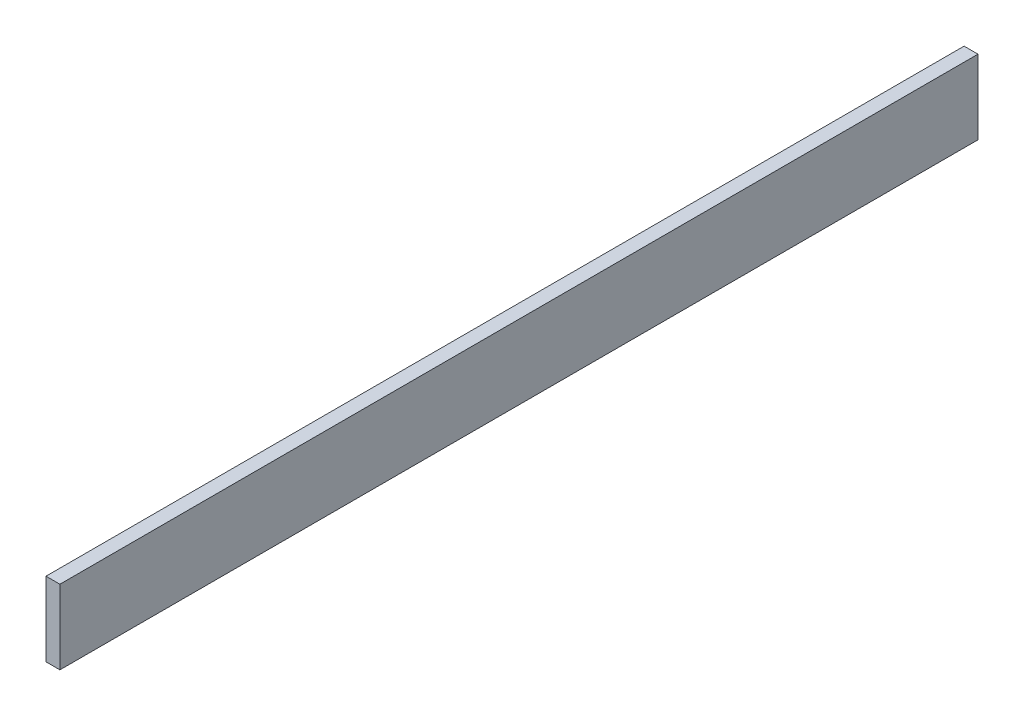
ISO-10303-21;
HEADER;
FILE_DESCRIPTION(('STEP AP214'),'2;1');
FILE_NAME('part.step','',(''),(''),'','','');
FILE_SCHEMA(('AUTOMOTIVE_DESIGN { 1 0 10303 214 1 1 1 1 }'));
ENDSEC;
DATA;
#1=APPLICATION_CONTEXT('core data for automotive mechanical design processes');
#2=APPLICATION_PROTOCOL_DEFINITION('international standard','automotive_design',2000,#1);
#3=PRODUCT_CONTEXT('',#1,'mechanical');
#4=PRODUCT('Part','Part','',(#3));
#5=PRODUCT_RELATED_PRODUCT_CATEGORY('part','',(#4));
#6=PRODUCT_DEFINITION_FORMATION('','',#4);
#7=PRODUCT_DEFINITION_CONTEXT('part definition',#1,'design');
#8=PRODUCT_DEFINITION('design','',#6,#7);
#9=PRODUCT_DEFINITION_SHAPE('','',#8);
#10=(LENGTH_UNIT() NAMED_UNIT(*) SI_UNIT(.MILLI.,.METRE.));
#11=(NAMED_UNIT(*) PLANE_ANGLE_UNIT() SI_UNIT($,.RADIAN.));
#12=(NAMED_UNIT(*) SI_UNIT($,.STERADIAN.) SOLID_ANGLE_UNIT());
#13=UNCERTAINTY_MEASURE_WITH_UNIT(LENGTH_MEASURE(1.E-05),#10,'distance_accuracy_value','');
#14=(GEOMETRIC_REPRESENTATION_CONTEXT(3) GLOBAL_UNCERTAINTY_ASSIGNED_CONTEXT((#13)) GLOBAL_UNIT_ASSIGNED_CONTEXT((#10,
#11,#12)) REPRESENTATION_CONTEXT('',''));
#15=CARTESIAN_POINT('',(0.,0.,0.));
#16=DIRECTION('',(0.,0.,1.));
#17=DIRECTION('',(1.,0.,0.));
#18=AXIS2_PLACEMENT_3D('',#15,#16,#17);
#19=CARTESIAN_POINT('',(19.05,-50.8000000000001,-628.65));
#20=DIRECTION('',(0.,0.,1.));
#21=DIRECTION('',(1.,0.,0.));
#22=AXIS2_PLACEMENT_3D('',#19,#20,#21);
#23=PLANE('',#22);
#24=DIRECTION('',(0.,1.,0.));
#25=VECTOR('',#24,1.);
#26=CARTESIAN_POINT('',(0.,-50.8000000000001,-628.65));
#27=LINE('',#26,#25);
#28=CARTESIAN_POINT('',(0.,-50.8000000000001,-628.65));
#29=VERTEX_POINT('',#28);
#30=CARTESIAN_POINT('',(0.,50.8,-628.65));
#31=VERTEX_POINT('',#30);
#32=EDGE_CURVE('E96',#29,#31,#27,.T.);
#33=ORIENTED_EDGE('',*,*,#32,.T.);
#34=DIRECTION('',(-1.,0.,0.));
#35=VECTOR('',#34,1.);
#36=CARTESIAN_POINT('',(19.05,50.8,-628.65));
#37=LINE('',#36,#35);
#38=CARTESIAN_POINT('',(19.05,50.8,-628.65));
#39=VERTEX_POINT('',#38);
#40=EDGE_CURVE('E11',#39,#31,#37,.T.);
#41=ORIENTED_EDGE('',*,*,#40,.F.);
#42=DIRECTION('',(0.,1.,0.));
#43=VECTOR('',#42,1.);
#44=CARTESIAN_POINT('',(19.05,-50.8000000000001,-628.65));
#45=LINE('',#44,#43);
#46=CARTESIAN_POINT('',(19.05,-50.8000000000001,-628.65));
#47=VERTEX_POINT('',#46);
#48=EDGE_CURVE('E84',#47,#39,#45,.T.);
#49=ORIENTED_EDGE('',*,*,#48,.F.);
#50=DIRECTION('',(-1.,0.,0.));
#51=VECTOR('',#50,1.);
#52=CARTESIAN_POINT('',(19.05,-50.8000000000001,-628.65));
#53=LINE('',#52,#51);
#54=EDGE_CURVE('E92',#47,#29,#53,.T.);
#55=ORIENTED_EDGE('',*,*,#54,.T.);
#56=EDGE_LOOP('',(#33,#41,#49,#55));
#57=FACE_BOUND('',#56,.T.);
#58=ADVANCED_FACE('F33',(#57),#23,.F.);
#59=CARTESIAN_POINT('',(19.05,50.8,628.65));
#60=DIRECTION('',(0.,-1.,0.));
#61=DIRECTION('',(0.,0.,-1.));
#62=AXIS2_PLACEMENT_3D('',#59,#60,#61);
#63=PLANE('',#62);
#64=DIRECTION('',(0.,0.,1.));
#65=VECTOR('',#64,1.);
#66=CARTESIAN_POINT('',(0.,50.8,628.65));
#67=LINE('',#66,#65);
#68=CARTESIAN_POINT('',(0.,50.8,628.65));
#69=VERTEX_POINT('',#68);
#70=EDGE_CURVE('E88',#31,#69,#67,.T.);
#71=ORIENTED_EDGE('',*,*,#70,.T.);
#72=DIRECTION('',(-1.,0.,0.));
#73=VECTOR('',#72,1.);
#74=CARTESIAN_POINT('',(19.05,50.8,628.65));
#75=LINE('',#74,#73);
#76=CARTESIAN_POINT('',(19.05,50.8,628.65));
#77=VERTEX_POINT('',#76);
#78=EDGE_CURVE('E41',#77,#69,#75,.T.);
#79=ORIENTED_EDGE('',*,*,#78,.F.);
#80=DIRECTION('',(0.,0.,1.));
#81=VECTOR('',#80,1.);
#82=CARTESIAN_POINT('',(19.05,50.8,628.65));
#83=LINE('',#82,#81);
#84=EDGE_CURVE('E79',#39,#77,#83,.T.);
#85=ORIENTED_EDGE('',*,*,#84,.F.);
#86=ORIENTED_EDGE('',*,*,#40,.T.);
#87=EDGE_LOOP('',(#71,#79,#85,#86));
#88=FACE_BOUND('',#87,.T.);
#89=ADVANCED_FACE('F87',(#88),#63,.F.);
#90=CARTESIAN_POINT('',(19.05,-50.8000000000001,628.65));
#91=DIRECTION('',(0.,0.,-1.));
#92=DIRECTION('',(-1.,0.,0.));
#93=AXIS2_PLACEMENT_3D('',#90,#91,#92);
#94=PLANE('',#93);
#95=DIRECTION('',(0.,-1.,0.));
#96=VECTOR('',#95,1.);
#97=CARTESIAN_POINT('',(0.,-50.8000000000001,628.65));
#98=LINE('',#97,#96);
#99=CARTESIAN_POINT('',(0.,-50.8000000000001,628.65));
#100=VERTEX_POINT('',#99);
#101=EDGE_CURVE('E66',#69,#100,#98,.T.);
#102=ORIENTED_EDGE('',*,*,#101,.T.);
#103=DIRECTION('',(-1.,0.,0.));
#104=VECTOR('',#103,1.);
#105=CARTESIAN_POINT('',(19.05,-50.8000000000001,628.65));
#106=LINE('',#105,#104);
#107=CARTESIAN_POINT('',(19.05,-50.8000000000001,628.65));
#108=VERTEX_POINT('',#107);
#109=EDGE_CURVE('E89',#108,#100,#106,.T.);
#110=ORIENTED_EDGE('',*,*,#109,.F.);
#111=DIRECTION('',(0.,-1.,0.));
#112=VECTOR('',#111,1.);
#113=CARTESIAN_POINT('',(19.05,-50.8000000000001,628.65));
#114=LINE('',#113,#112);
#115=EDGE_CURVE('E82',#77,#108,#114,.T.);
#116=ORIENTED_EDGE('',*,*,#115,.F.);
#117=ORIENTED_EDGE('',*,*,#78,.T.);
#118=EDGE_LOOP('',(#102,#110,#116,#117));
#119=FACE_BOUND('',#118,.T.);
#120=ADVANCED_FACE('F90',(#119),#94,.F.);
#121=CARTESIAN_POINT('',(19.05,-50.8000000000001,628.65));
#122=DIRECTION('',(0.,1.,0.));
#123=DIRECTION('',(0.,0.,1.));
#124=AXIS2_PLACEMENT_3D('',#121,#122,#123);
#125=PLANE('',#124);
#126=DIRECTION('',(0.,0.,-1.));
#127=VECTOR('',#126,1.);
#128=CARTESIAN_POINT('',(0.,-50.8000000000001,628.65));
#129=LINE('',#128,#127);
#130=EDGE_CURVE('E72',#100,#29,#129,.T.);
#131=ORIENTED_EDGE('',*,*,#130,.T.);
#132=ORIENTED_EDGE('',*,*,#54,.F.);
#133=DIRECTION('',(0.,0.,-1.));
#134=VECTOR('',#133,1.);
#135=CARTESIAN_POINT('',(19.05,-50.8000000000001,628.65));
#136=LINE('',#135,#134);
#137=EDGE_CURVE('E49',#108,#47,#136,.T.);
#138=ORIENTED_EDGE('',*,*,#137,.F.);
#139=ORIENTED_EDGE('',*,*,#109,.T.);
#140=EDGE_LOOP('',(#131,#132,#138,#139));
#141=FACE_BOUND('',#140,.T.);
#142=ADVANCED_FACE('F103',(#141),#125,.F.);
#143=CARTESIAN_POINT('',(19.05,0.,0.));
#144=DIRECTION('',(-1.,0.,0.));
#145=DIRECTION('',(0.,0.,1.));
#146=AXIS2_PLACEMENT_3D('',#143,#144,#145);
#147=PLANE('',#146);
#148=ORIENTED_EDGE('',*,*,#48,.T.);
#149=ORIENTED_EDGE('',*,*,#84,.T.);
#150=ORIENTED_EDGE('',*,*,#115,.T.);
#151=ORIENTED_EDGE('',*,*,#137,.T.);
#152=EDGE_LOOP('',(#148,#149,#150,#151));
#153=FACE_BOUND('',#152,.T.);
#154=ADVANCED_FACE('F80',(#153),#147,.F.);
#155=CARTESIAN_POINT('',(0.,0.,0.));
#156=DIRECTION('',(-1.,0.,0.));
#157=DIRECTION('',(0.,0.,1.));
#158=AXIS2_PLACEMENT_3D('',#155,#156,#157);
#159=PLANE('',#158);
#160=ORIENTED_EDGE('',*,*,#32,.F.);
#161=ORIENTED_EDGE('',*,*,#130,.F.);
#162=ORIENTED_EDGE('',*,*,#101,.F.);
#163=ORIENTED_EDGE('',*,*,#70,.F.);
#164=EDGE_LOOP('',(#160,#161,#162,#163));
#165=FACE_BOUND('',#164,.T.);
#166=ADVANCED_FACE('F106',(#165),#159,.T.);
#167=CLOSED_SHELL('',(#58,#89,#120,#142,#154,#166));
#168=MANIFOLD_SOLID_BREP('B2',#167);
#169=ADVANCED_BREP_SHAPE_REPRESENTATION('',(#18,#168),#14);
#170=SHAPE_DEFINITION_REPRESENTATION(#9,#169);
ENDSEC;
END-ISO-10303-21;
